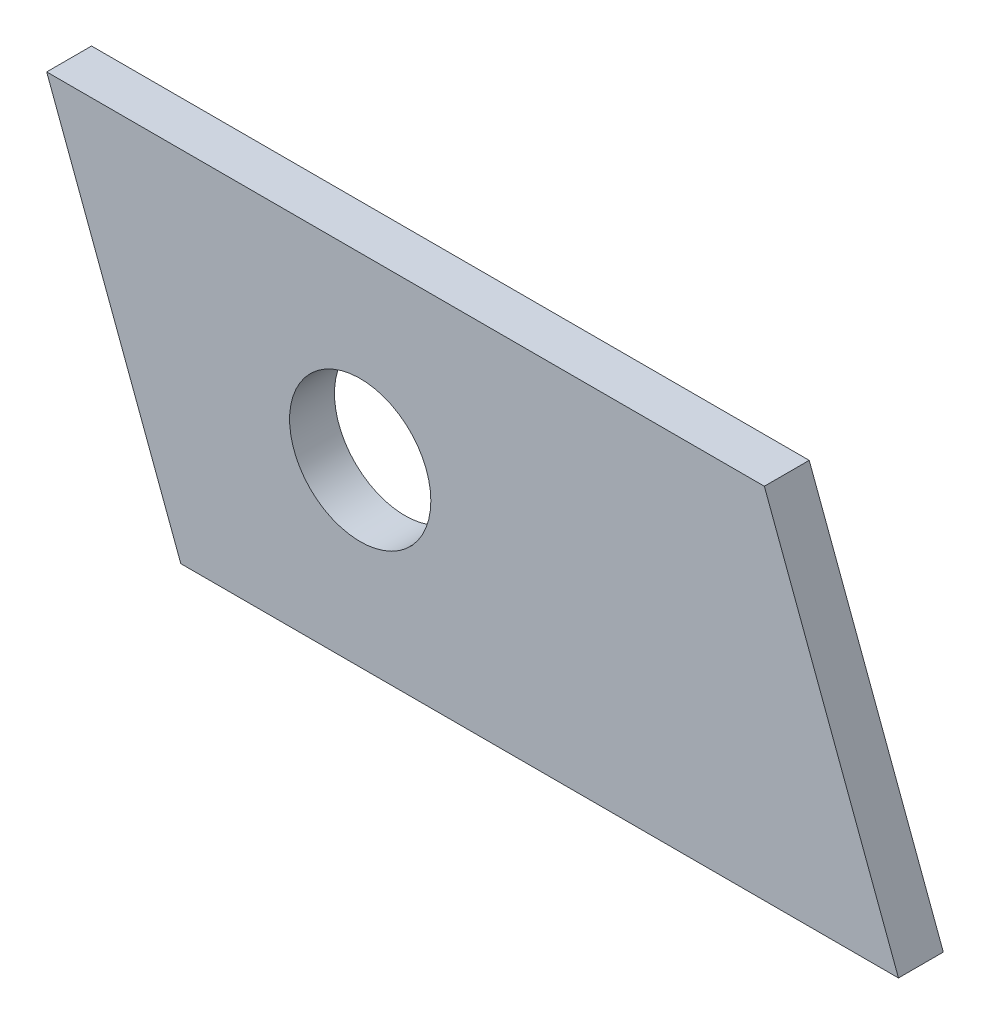
ISO-10303-21;
HEADER;
FILE_DESCRIPTION(('STEP AP214'),'2;1');
FILE_NAME('part.step','',(''),(''),'','','');
FILE_SCHEMA(('AUTOMOTIVE_DESIGN { 1 0 10303 214 1 1 1 1 }'));
ENDSEC;
DATA;
#1=APPLICATION_CONTEXT('core data for automotive mechanical design processes');
#2=APPLICATION_PROTOCOL_DEFINITION('international standard','automotive_design',2000,#1);
#3=PRODUCT_CONTEXT('',#1,'mechanical');
#4=PRODUCT('Part','Part','',(#3));
#5=PRODUCT_RELATED_PRODUCT_CATEGORY('part','',(#4));
#6=PRODUCT_DEFINITION_FORMATION('','',#4);
#7=PRODUCT_DEFINITION_CONTEXT('part definition',#1,'design');
#8=PRODUCT_DEFINITION('design','',#6,#7);
#9=PRODUCT_DEFINITION_SHAPE('','',#8);
#10=(LENGTH_UNIT() NAMED_UNIT(*) SI_UNIT(.MILLI.,.METRE.));
#11=(NAMED_UNIT(*) PLANE_ANGLE_UNIT() SI_UNIT($,.RADIAN.));
#12=(NAMED_UNIT(*) SI_UNIT($,.STERADIAN.) SOLID_ANGLE_UNIT());
#13=UNCERTAINTY_MEASURE_WITH_UNIT(LENGTH_MEASURE(1.E-05),#10,'distance_accuracy_value','');
#14=(GEOMETRIC_REPRESENTATION_CONTEXT(3) GLOBAL_UNCERTAINTY_ASSIGNED_CONTEXT((#13)) GLOBAL_UNIT_ASSIGNED_CONTEXT((#10,
#11,#12)) REPRESENTATION_CONTEXT('',''));
#15=CARTESIAN_POINT('',(0.,0.,0.));
#16=DIRECTION('',(0.,0.,1.));
#17=DIRECTION('',(1.,0.,0.));
#18=AXIS2_PLACEMENT_3D('',#15,#16,#17);
#19=CARTESIAN_POINT('',(-167.90690503939,117.173081746609,-3.175));
#20=DIRECTION('',(0.,1.,0.));
#21=DIRECTION('',(-1.,0.,0.));
#22=AXIS2_PLACEMENT_3D('',#19,#20,#21);
#23=PLANE('',#22);
#24=DIRECTION('',(-1.,0.,0.));
#25=VECTOR('',#24,1.);
#26=CARTESIAN_POINT('',(-167.90690503939,117.173081746609,0.));
#27=LINE('',#26,#25);
#28=CARTESIAN_POINT('',(-167.90690503939,117.173081746609,0.));
#29=VERTEX_POINT('',#28);
#30=CARTESIAN_POINT('',(-218.70690503939,117.173081746609,0.));
#31=VERTEX_POINT('',#30);
#32=EDGE_CURVE('E106',#29,#31,#27,.T.);
#33=ORIENTED_EDGE('',*,*,#32,.F.);
#34=DIRECTION('',(0.,0.,1.));
#35=VECTOR('',#34,1.);
#36=CARTESIAN_POINT('',(-167.90690503939,117.173081746609,-3.175));
#37=LINE('',#36,#35);
#38=CARTESIAN_POINT('',(-167.90690503939,117.173081746609,-3.175));
#39=VERTEX_POINT('',#38);
#40=EDGE_CURVE('E11',#39,#29,#37,.T.);
#41=ORIENTED_EDGE('',*,*,#40,.F.);
#42=DIRECTION('',(-1.,0.,0.));
#43=VECTOR('',#42,1.);
#44=CARTESIAN_POINT('',(-167.90690503939,117.173081746609,-3.175));
#45=LINE('',#44,#43);
#46=CARTESIAN_POINT('',(-218.70690503939,117.173081746609,-3.175));
#47=VERTEX_POINT('',#46);
#48=EDGE_CURVE('E99',#39,#47,#45,.T.);
#49=ORIENTED_EDGE('',*,*,#48,.T.);
#50=DIRECTION('',(0.,0.,1.));
#51=VECTOR('',#50,1.);
#52=CARTESIAN_POINT('',(-218.70690503939,117.173081746609,-3.175));
#53=LINE('',#52,#51);
#54=EDGE_CURVE('E44',#47,#31,#53,.T.);
#55=ORIENTED_EDGE('',*,*,#54,.T.);
#56=EDGE_LOOP('',(#33,#41,#49,#55));
#57=FACE_BOUND('',#56,.T.);
#58=ADVANCED_FACE('F41',(#57),#23,.T.);
#59=CARTESIAN_POINT('',(-167.90690503939,117.173081746609,-3.175));
#60=DIRECTION('',(0.936712289938726,0.350100108365804,0.));
#61=DIRECTION('',(-0.350100108365804,0.936712289938726,0.));
#62=AXIS2_PLACEMENT_3D('',#59,#60,#61);
#63=PLANE('',#62);
#64=DIRECTION('',(-0.350100108365804,0.936712289938726,0.));
#65=VECTOR('',#64,1.);
#66=CARTESIAN_POINT('',(-167.90690503939,117.173081746609,0.));
#67=LINE('',#66,#65);
#68=CARTESIAN_POINT('',(-158.413549557663,91.773081746609,0.));
#69=VERTEX_POINT('',#68);
#70=EDGE_CURVE('E101',#69,#29,#67,.T.);
#71=ORIENTED_EDGE('',*,*,#70,.F.);
#72=DIRECTION('',(0.,0.,1.));
#73=VECTOR('',#72,1.);
#74=CARTESIAN_POINT('',(-158.413549557663,91.773081746609,-3.175));
#75=LINE('',#74,#73);
#76=CARTESIAN_POINT('',(-158.413549557663,91.773081746609,-3.175));
#77=VERTEX_POINT('',#76);
#78=EDGE_CURVE('E50',#77,#69,#75,.T.);
#79=ORIENTED_EDGE('',*,*,#78,.F.);
#80=DIRECTION('',(-0.350100108365804,0.936712289938726,0.));
#81=VECTOR('',#80,1.);
#82=CARTESIAN_POINT('',(-167.90690503939,117.173081746609,-3.175));
#83=LINE('',#82,#81);
#84=EDGE_CURVE('E96',#77,#39,#83,.T.);
#85=ORIENTED_EDGE('',*,*,#84,.T.);
#86=ORIENTED_EDGE('',*,*,#40,.T.);
#87=EDGE_LOOP('',(#71,#79,#85,#86));
#88=FACE_BOUND('',#87,.T.);
#89=ADVANCED_FACE('F117',(#88),#63,.T.);
#90=CARTESIAN_POINT('',(-209.213549557663,91.773081746609,-3.175));
#91=DIRECTION('',(0.,-1.,0.));
#92=DIRECTION('',(0.,0.,-1.));
#93=AXIS2_PLACEMENT_3D('',#90,#91,#92);
#94=PLANE('',#93);
#95=DIRECTION('',(1.,0.,0.));
#96=VECTOR('',#95,1.);
#97=CARTESIAN_POINT('',(-209.213549557663,91.773081746609,0.));
#98=LINE('',#97,#96);
#99=CARTESIAN_POINT('',(-209.213549557663,91.773081746609,0.));
#100=VERTEX_POINT('',#99);
#101=EDGE_CURVE('E91',#100,#69,#98,.T.);
#102=ORIENTED_EDGE('',*,*,#101,.F.);
#103=DIRECTION('',(0.,0.,1.));
#104=VECTOR('',#103,1.);
#105=CARTESIAN_POINT('',(-209.213549557663,91.773081746609,-3.175));
#106=LINE('',#105,#104);
#107=CARTESIAN_POINT('',(-209.213549557663,91.773081746609,-3.175));
#108=VERTEX_POINT('',#107);
#109=EDGE_CURVE('E86',#108,#100,#106,.T.);
#110=ORIENTED_EDGE('',*,*,#109,.F.);
#111=DIRECTION('',(1.,0.,0.));
#112=VECTOR('',#111,1.);
#113=CARTESIAN_POINT('',(-209.213549557663,91.773081746609,-3.175));
#114=LINE('',#113,#112);
#115=EDGE_CURVE('E89',#108,#77,#114,.T.);
#116=ORIENTED_EDGE('',*,*,#115,.T.);
#117=ORIENTED_EDGE('',*,*,#78,.T.);
#118=EDGE_LOOP('',(#102,#110,#116,#117));
#119=FACE_BOUND('',#118,.T.);
#120=ADVANCED_FACE('F88',(#119),#94,.T.);
#121=CARTESIAN_POINT('',(-218.70690503939,117.173081746609,-3.175));
#122=DIRECTION('',(-0.936712289938726,-0.350100108365804,0.));
#123=DIRECTION('',(0.350100108365804,-0.936712289938726,0.));
#124=AXIS2_PLACEMENT_3D('',#121,#122,#123);
#125=PLANE('',#124);
#126=DIRECTION('',(0.350100108365804,-0.936712289938726,0.));
#127=VECTOR('',#126,1.);
#128=CARTESIAN_POINT('',(-218.70690503939,117.173081746609,0.));
#129=LINE('',#128,#127);
#130=EDGE_CURVE('E109',#31,#100,#129,.T.);
#131=ORIENTED_EDGE('',*,*,#130,.F.);
#132=ORIENTED_EDGE('',*,*,#54,.F.);
#133=DIRECTION('',(0.350100108365804,-0.936712289938726,0.));
#134=VECTOR('',#133,1.);
#135=CARTESIAN_POINT('',(-218.70690503939,117.173081746609,-3.175));
#136=LINE('',#135,#134);
#137=EDGE_CURVE('E95',#47,#108,#136,.T.);
#138=ORIENTED_EDGE('',*,*,#137,.T.);
#139=ORIENTED_EDGE('',*,*,#109,.T.);
#140=EDGE_LOOP('',(#131,#132,#138,#139));
#141=FACE_BOUND('',#140,.T.);
#142=ADVANCED_FACE('F98',(#141),#125,.T.);
#143=CARTESIAN_POINT('',(0.,0.,-3.175));
#144=DIRECTION('',(0.,0.,1.));
#145=DIRECTION('',(1.,0.,0.));
#146=AXIS2_PLACEMENT_3D('',#143,#144,#145);
#147=PLANE('',#146);
#148=CARTESIAN_POINT('',(-196.513549557663,104.473081746609,-3.175));
#149=DIRECTION('',(0.,0.,1.));
#150=DIRECTION('',(1.,0.,0.));
#151=AXIS2_PLACEMENT_3D('',#148,#149,#150);
#152=CIRCLE('',#151,5.00000000000002);
#153=CARTESIAN_POINT('',(-191.513549557663,104.473081746609,-3.175));
#154=VERTEX_POINT('',#153);
#155=EDGE_CURVE('E110',#154,#154,#152,.T.);
#156=ORIENTED_EDGE('',*,*,#155,.T.);
#157=EDGE_LOOP('',(#156));
#158=FACE_BOUND('',#157,.T.);
#159=ORIENTED_EDGE('',*,*,#48,.F.);
#160=ORIENTED_EDGE('',*,*,#84,.F.);
#161=ORIENTED_EDGE('',*,*,#115,.F.);
#162=ORIENTED_EDGE('',*,*,#137,.F.);
#163=EDGE_LOOP('',(#159,#160,#161,#162));
#164=FACE_BOUND('',#163,.T.);
#165=ADVANCED_FACE('F94',(#158,#164),#147,.F.);
#166=CARTESIAN_POINT('',(0.,0.,0.));
#167=DIRECTION('',(0.,0.,1.));
#168=DIRECTION('',(1.,0.,0.));
#169=AXIS2_PLACEMENT_3D('',#166,#167,#168);
#170=PLANE('',#169);
#171=CARTESIAN_POINT('',(-196.513549557663,104.473081746609,0.));
#172=DIRECTION('',(0.,0.,1.));
#173=DIRECTION('',(1.,0.,0.));
#174=AXIS2_PLACEMENT_3D('',#171,#172,#173);
#175=CIRCLE('',#174,5.00000000000002);
#176=CARTESIAN_POINT('',(-191.513549557663,104.473081746609,0.));
#177=VERTEX_POINT('',#176);
#178=EDGE_CURVE('E147',#177,#177,#175,.T.);
#179=ORIENTED_EDGE('',*,*,#178,.F.);
#180=EDGE_LOOP('',(#179));
#181=FACE_BOUND('',#180,.T.);
#182=ORIENTED_EDGE('',*,*,#32,.T.);
#183=ORIENTED_EDGE('',*,*,#130,.T.);
#184=ORIENTED_EDGE('',*,*,#101,.T.);
#185=ORIENTED_EDGE('',*,*,#70,.T.);
#186=EDGE_LOOP('',(#182,#183,#184,#185));
#187=FACE_BOUND('',#186,.T.);
#188=ADVANCED_FACE('F116',(#181,#187),#170,.T.);
#189=CARTESIAN_POINT('',(-196.513549557663,104.473081746609,-3.175));
#190=DIRECTION('',(0.,0.,1.));
#191=DIRECTION('',(1.,0.,0.));
#192=AXIS2_PLACEMENT_3D('',#189,#190,#191);
#193=CYLINDRICAL_SURFACE('',#192,5.00000000000002);
#194=ORIENTED_EDGE('',*,*,#155,.F.);
#195=EDGE_LOOP('',(#194));
#196=FACE_BOUND('',#195,.T.);
#197=ORIENTED_EDGE('',*,*,#178,.T.);
#198=EDGE_LOOP('',(#197));
#199=FACE_BOUND('',#198,.T.);
#200=ADVANCED_FACE('F135',(#196,#199),#193,.F.);
#201=CLOSED_SHELL('',(#58,#89,#120,#142,#165,#188,#200));
#202=MANIFOLD_SOLID_BREP('B2',#201);
#203=ADVANCED_BREP_SHAPE_REPRESENTATION('',(#18,#202),#14);
#204=SHAPE_DEFINITION_REPRESENTATION(#9,#203);
ENDSEC;
END-ISO-10303-21;
